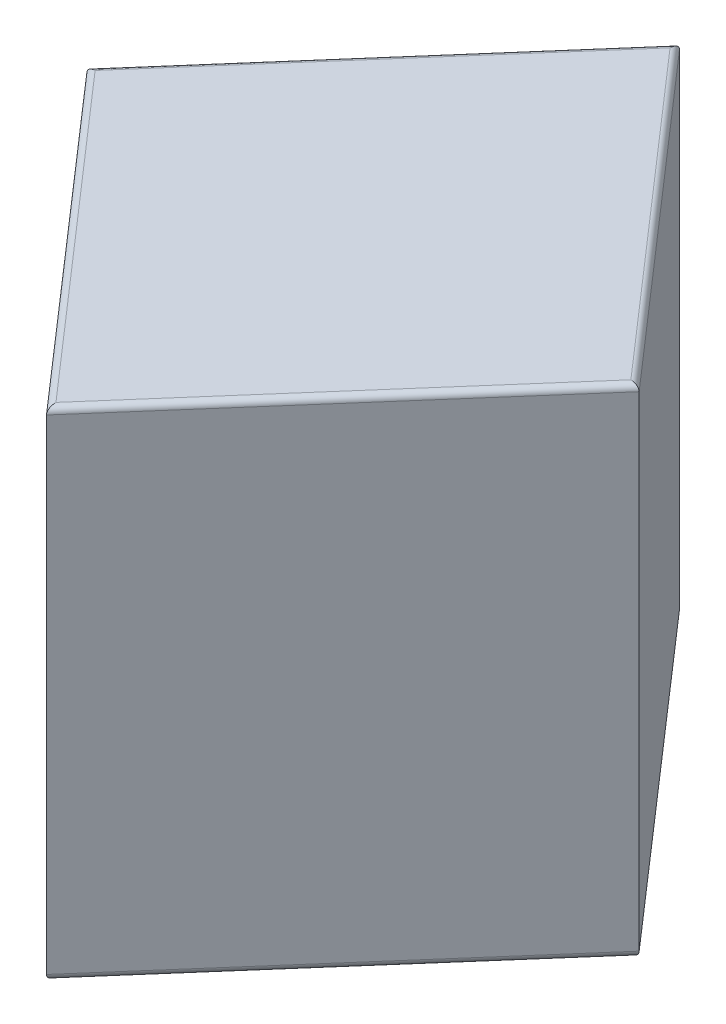
ISO-10303-21;
HEADER;
FILE_DESCRIPTION(('STEP AP214'),'2;1');
FILE_NAME('part.step','',(''),(''),'','','');
FILE_SCHEMA(('AUTOMOTIVE_DESIGN { 1 0 10303 214 1 1 1 1 }'));
ENDSEC;
DATA;
#1=APPLICATION_CONTEXT('core data for automotive mechanical design processes');
#2=APPLICATION_PROTOCOL_DEFINITION('international standard','automotive_design',2000,#1);
#3=PRODUCT_CONTEXT('',#1,'mechanical');
#4=PRODUCT('Part','Part','',(#3));
#5=PRODUCT_RELATED_PRODUCT_CATEGORY('part','',(#4));
#6=PRODUCT_DEFINITION_FORMATION('','',#4);
#7=PRODUCT_DEFINITION_CONTEXT('part definition',#1,'design');
#8=PRODUCT_DEFINITION('design','',#6,#7);
#9=PRODUCT_DEFINITION_SHAPE('','',#8);
#10=(LENGTH_UNIT() NAMED_UNIT(*) SI_UNIT(.MILLI.,.METRE.));
#11=(NAMED_UNIT(*) PLANE_ANGLE_UNIT() SI_UNIT($,.RADIAN.));
#12=(NAMED_UNIT(*) SI_UNIT($,.STERADIAN.) SOLID_ANGLE_UNIT());
#13=UNCERTAINTY_MEASURE_WITH_UNIT(LENGTH_MEASURE(1.E-05),#10,'distance_accuracy_value','');
#14=(GEOMETRIC_REPRESENTATION_CONTEXT(3) GLOBAL_UNCERTAINTY_ASSIGNED_CONTEXT((#13)) GLOBAL_UNIT_ASSIGNED_CONTEXT((#10,
#11,#12)) REPRESENTATION_CONTEXT('',''));
#15=CARTESIAN_POINT('',(0.,0.,0.));
#16=DIRECTION('',(0.,0.,1.));
#17=DIRECTION('',(1.,0.,0.));
#18=AXIS2_PLACEMENT_3D('',#15,#16,#17);
#19=CARTESIAN_POINT('',(0.,40.,25.478872713594));
#20=DIRECTION('',(0.753535334729481,0.,-0.657407407407408));
#21=DIRECTION('',(-0.657407407407408,0.,-0.753535334729481));
#22=AXIS2_PLACEMENT_3D('',#19,#20,#21);
#23=PLANE('',#22);
#24=DIRECTION('',(0.,-1.,0.));
#25=VECTOR('',#24,1.);
#26=CARTESIAN_POINT('',(-22.2285528335752,40.,-5.25842666447823E-07));
#27=LINE('',#26,#25);
#28=CARTESIAN_POINT('',(-22.2285528335752,39.5,-5.25842666447823E-07));
#29=VERTEX_POINT('',#28);
#30=CARTESIAN_POINT('',(-22.2285528335752,0.5,-5.25842666447823E-07));
#31=VERTEX_POINT('',#30);
#32=EDGE_CURVE('E163',#29,#31,#27,.T.);
#33=ORIENTED_EDGE('',*,*,#32,.T.);
#34=DIRECTION('',(0.657407407407408,0.,0.753535334729481));
#35=VECTOR('',#34,1.);
#36=CARTESIAN_POINT('',(0.,0.5,25.478872713594));
#37=LINE('',#36,#35);
#38=CARTESIAN_POINT('',(0.,0.5,25.478872713594));
#39=VERTEX_POINT('',#38);
#40=EDGE_CURVE('E130',#31,#39,#37,.T.);
#41=ORIENTED_EDGE('',*,*,#40,.T.);
#42=DIRECTION('',(0.,-1.,0.));
#43=VECTOR('',#42,1.);
#44=CARTESIAN_POINT('',(0.,40.,25.478872713594));
#45=LINE('',#44,#43);
#46=CARTESIAN_POINT('',(0.,39.5,25.478872713594));
#47=VERTEX_POINT('',#46);
#48=EDGE_CURVE('E114',#47,#39,#45,.T.);
#49=ORIENTED_EDGE('',*,*,#48,.F.);
#50=DIRECTION('',(0.657407407407408,0.,0.753535334729481));
#51=VECTOR('',#50,1.);
#52=CARTESIAN_POINT('',(0.,39.5,25.478872713594));
#53=LINE('',#52,#51);
#54=EDGE_CURVE('E127',#47,#29,#53,.F.);
#55=ORIENTED_EDGE('',*,*,#54,.T.);
#56=EDGE_LOOP('',(#33,#41,#49,#55));
#57=FACE_BOUND('',#56,.T.);
#58=ADVANCED_FACE('F43',(#57),#23,.F.);
#59=CARTESIAN_POINT('',(22.2285528335751,40.,-5.25842675826171E-07));
#60=DIRECTION('',(-0.753535334729482,0.,-0.657407407407407));
#61=DIRECTION('',(-0.657407407407407,0.,0.753535334729482));
#62=AXIS2_PLACEMENT_3D('',#59,#60,#61);
#63=PLANE('',#62);
#64=ORIENTED_EDGE('',*,*,#48,.T.);
#65=DIRECTION('',(0.657407407407407,0.,-0.753535334729482));
#66=VECTOR('',#65,1.);
#67=CARTESIAN_POINT('',(22.2285528335751,0.5,-5.25842675949297E-07));
#68=LINE('',#67,#66);
#69=CARTESIAN_POINT('',(22.2285528335751,0.5,-5.25842675826171E-07));
#70=VERTEX_POINT('',#69);
#71=EDGE_CURVE('E120',#39,#70,#68,.T.);
#72=ORIENTED_EDGE('',*,*,#71,.T.);
#73=DIRECTION('',(0.,-1.,0.));
#74=VECTOR('',#73,1.);
#75=CARTESIAN_POINT('',(22.2285528335751,40.,-5.25842675826171E-07));
#76=LINE('',#75,#74);
#77=CARTESIAN_POINT('',(22.2285528335751,39.5,-5.25842675826171E-07));
#78=VERTEX_POINT('',#77);
#79=EDGE_CURVE('E116',#78,#70,#76,.T.);
#80=ORIENTED_EDGE('',*,*,#79,.F.);
#81=DIRECTION('',(0.657407407407407,0.,-0.753535334729482));
#82=VECTOR('',#81,1.);
#83=CARTESIAN_POINT('',(22.2285528335751,39.5,-5.25842675826171E-07));
#84=LINE('',#83,#82);
#85=EDGE_CURVE('E111',#78,#47,#84,.F.);
#86=ORIENTED_EDGE('',*,*,#85,.T.);
#87=EDGE_LOOP('',(#64,#72,#80,#86));
#88=FACE_BOUND('',#87,.T.);
#89=ADVANCED_FACE('F113',(#88),#63,.F.);
#90=CARTESIAN_POINT('',(0.,40.,-25.4788737652793));
#91=DIRECTION('',(-0.753535334729481,0.,0.657407407407407));
#92=DIRECTION('',(0.657407407407407,0.,0.753535334729481));
#93=AXIS2_PLACEMENT_3D('',#90,#91,#92);
#94=PLANE('',#93);
#95=ORIENTED_EDGE('',*,*,#79,.T.);
#96=DIRECTION('',(-0.657407407407407,0.,-0.753535334729481));
#97=VECTOR('',#96,1.);
#98=CARTESIAN_POINT('',(0.,0.5,-25.4788737652793));
#99=LINE('',#98,#97);
#100=CARTESIAN_POINT('',(0.,0.5,-25.4788737652793));
#101=VERTEX_POINT('',#100);
#102=EDGE_CURVE('E187',#70,#101,#99,.T.);
#103=ORIENTED_EDGE('',*,*,#102,.T.);
#104=DIRECTION('',(0.,-1.,0.));
#105=VECTOR('',#104,1.);
#106=CARTESIAN_POINT('',(0.,40.,-25.4788737652793));
#107=LINE('',#106,#105);
#108=CARTESIAN_POINT('',(0.,39.5,-25.4788737652793));
#109=VERTEX_POINT('',#108);
#110=EDGE_CURVE('E168',#109,#101,#107,.T.);
#111=ORIENTED_EDGE('',*,*,#110,.F.);
#112=DIRECTION('',(-0.657407407407407,0.,-0.753535334729481));
#113=VECTOR('',#112,1.);
#114=CARTESIAN_POINT('',(0.,39.5,-25.4788737652793));
#115=LINE('',#114,#113);
#116=EDGE_CURVE('E185',#109,#78,#115,.F.);
#117=ORIENTED_EDGE('',*,*,#116,.T.);
#118=EDGE_LOOP('',(#95,#103,#111,#117));
#119=FACE_BOUND('',#118,.T.);
#120=ADVANCED_FACE('F204',(#119),#94,.F.);
#121=CARTESIAN_POINT('',(-22.2285528335752,40.,-5.25842666447823E-07));
#122=DIRECTION('',(0.753535334729481,0.,0.657407407407407));
#123=DIRECTION('',(0.657407407407407,0.,-0.753535334729481));
#124=AXIS2_PLACEMENT_3D('',#121,#122,#123);
#125=PLANE('',#124);
#126=ORIENTED_EDGE('',*,*,#110,.T.);
#127=DIRECTION('',(-0.657407407407407,0.,0.753535334729481));
#128=VECTOR('',#127,1.);
#129=CARTESIAN_POINT('',(-22.2285528335752,0.5,-5.25842666417041E-07));
#130=LINE('',#129,#128);
#131=EDGE_CURVE('E191',#101,#31,#130,.T.);
#132=ORIENTED_EDGE('',*,*,#131,.T.);
#133=ORIENTED_EDGE('',*,*,#32,.F.);
#134=DIRECTION('',(-0.657407407407407,0.,0.753535334729481));
#135=VECTOR('',#134,1.);
#136=CARTESIAN_POINT('',(-22.2285528335752,39.5,-5.25842666447823E-07));
#137=LINE('',#136,#135);
#138=EDGE_CURVE('E189',#29,#109,#137,.F.);
#139=ORIENTED_EDGE('',*,*,#138,.T.);
#140=EDGE_LOOP('',(#126,#132,#133,#139));
#141=FACE_BOUND('',#140,.T.);
#142=ADVANCED_FACE('F202',(#141),#125,.F.);
#143=CARTESIAN_POINT('',(0.,40.,0.));
#144=DIRECTION('',(0.,-1.,0.));
#145=DIRECTION('',(0.,0.,-1.));
#146=AXIS2_PLACEMENT_3D('',#143,#144,#145);
#147=PLANE('',#146);
#148=DIRECTION('',(-0.657407407407407,0.,0.753535334729481));
#149=VECTOR('',#148,1.);
#150=CARTESIAN_POINT('',(-12.2449494498459,40.,-10.6828705976314));
#151=LINE('',#150,#149);
#152=CARTESIAN_POINT('',(0.,40.,-24.7183103849976));
#153=VERTEX_POINT('',#152);
#154=CARTESIAN_POINT('',(-21.5650139430207,40.,-5.25842665452247E-07));
#155=VERTEX_POINT('',#154);
#156=EDGE_CURVE('E193',#153,#155,#151,.T.);
#157=ORIENTED_EDGE('',*,*,#156,.T.);
#158=DIRECTION('',(0.657407407407408,0.,0.753535334729481));
#159=VECTOR('',#158,1.);
#160=CARTESIAN_POINT('',(-12.2449489288623,40.,10.6828701431093));
#161=LINE('',#160,#159);
#162=CARTESIAN_POINT('',(0.,40.,24.7183093333123));
#163=VERTEX_POINT('',#162);
#164=EDGE_CURVE('E11',#155,#163,#161,.T.);
#165=ORIENTED_EDGE('',*,*,#164,.T.);
#166=DIRECTION('',(0.657407407407407,0.,-0.753535334729482));
#167=VECTOR('',#166,1.);
#168=CARTESIAN_POINT('',(12.2449489288623,40.,10.6828701431093));
#169=LINE('',#168,#167);
#170=CARTESIAN_POINT('',(21.5650139430207,40.,-5.25842671451091E-07));
#171=VERTEX_POINT('',#170);
#172=EDGE_CURVE('E52',#163,#171,#169,.T.);
#173=ORIENTED_EDGE('',*,*,#172,.T.);
#174=DIRECTION('',(-0.657407407407407,0.,-0.753535334729481));
#175=VECTOR('',#174,1.);
#176=CARTESIAN_POINT('',(12.2449494498459,40.,-10.6828705976314));
#177=LINE('',#176,#175);
#178=EDGE_CURVE('E195',#171,#153,#177,.T.);
#179=ORIENTED_EDGE('',*,*,#178,.T.);
#180=EDGE_LOOP('',(#157,#165,#173,#179));
#181=FACE_BOUND('',#180,.T.);
#182=ADVANCED_FACE('F196',(#181),#147,.F.);
#183=CARTESIAN_POINT('',(0.,0.,0.));
#184=DIRECTION('',(0.,-1.,0.));
#185=DIRECTION('',(0.,0.,-1.));
#186=AXIS2_PLACEMENT_3D('',#183,#184,#185);
#187=PLANE('',#186);
#188=DIRECTION('',(0.657407407407407,0.,-0.753535334729482));
#189=VECTOR('',#188,1.);
#190=CARTESIAN_POINT('',(-0.37676766736474,0.,25.1501690098903));
#191=LINE('',#190,#189);
#192=CARTESIAN_POINT('',(21.5650139430207,0.,-5.25842674113237E-07));
#193=VERTEX_POINT('',#192);
#194=CARTESIAN_POINT('',(0.,0.,24.7183093333123));
#195=VERTEX_POINT('',#194);
#196=EDGE_CURVE('E180',#193,#195,#191,.F.);
#197=ORIENTED_EDGE('',*,*,#196,.T.);
#198=DIRECTION('',(0.657407407407408,0.,0.753535334729481));
#199=VECTOR('',#198,1.);
#200=CARTESIAN_POINT('',(-21.8517851662104,0.,-0.328704229546371));
#201=LINE('',#200,#199);
#202=CARTESIAN_POINT('',(-21.5650139430207,0.,-5.25842666184628E-07));
#203=VERTEX_POINT('',#202);
#204=EDGE_CURVE('E121',#195,#203,#201,.F.);
#205=ORIENTED_EDGE('',*,*,#204,.T.);
#206=DIRECTION('',(-0.657407407407407,0.,0.753535334729481));
#207=VECTOR('',#206,1.);
#208=CARTESIAN_POINT('',(0.376767667364733,0.,-25.1501700615756));
#209=LINE('',#208,#207);
#210=CARTESIAN_POINT('',(0.,0.,-24.7183103849976));
#211=VERTEX_POINT('',#210);
#212=EDGE_CURVE('E176',#203,#211,#209,.F.);
#213=ORIENTED_EDGE('',*,*,#212,.T.);
#214=DIRECTION('',(-0.657407407407407,0.,-0.753535334729481));
#215=VECTOR('',#214,1.);
#216=CARTESIAN_POINT('',(21.8517851662104,0.,0.328703177861031));
#217=LINE('',#216,#215);
#218=EDGE_CURVE('E178',#211,#193,#217,.F.);
#219=ORIENTED_EDGE('',*,*,#218,.T.);
#220=EDGE_LOOP('',(#197,#205,#213,#219));
#221=FACE_BOUND('',#220,.T.);
#222=ADVANCED_FACE('F230',(#221),#187,.T.);
#223=CARTESIAN_POINT('',(-0.376767667364755,0.5,-25.1501700615756));
#224=DIRECTION('',(0.657407407407407,0.,0.753535334729481));
#225=DIRECTION('',(0.753535334729481,0.,-0.657407407407407));
#226=AXIS2_PLACEMENT_3D('',#223,#224,#225);
#227=CYLINDRICAL_SURFACE('',#226,0.5);
#228=CARTESIAN_POINT('',(21.5650139430206,0.5,-5.25842683740847E-07));
#229=DIRECTION('',(0.,0.,1.));
#230=DIRECTION('',(1.,0.,0.));
#231=AXIS2_PLACEMENT_3D('',#228,#229,#230);
#232=ELLIPSE('',#231,0.663538890554482,0.5);
#233=EDGE_CURVE('E155',#193,#70,#232,.T.);
#234=ORIENTED_EDGE('',*,*,#233,.F.);
#235=ORIENTED_EDGE('',*,*,#218,.F.);
#236=CARTESIAN_POINT('',(0.,0.5,-24.7183103849976));
#237=DIRECTION('',(1.,0.,0.));
#238=DIRECTION('',(0.,0.,-1.));
#239=AXIS2_PLACEMENT_3D('',#236,#237,#238);
#240=ELLIPSE('',#239,0.76056338028169,0.5);
#241=EDGE_CURVE('E142',#101,#211,#240,.F.);
#242=ORIENTED_EDGE('',*,*,#241,.F.);
#243=ORIENTED_EDGE('',*,*,#102,.F.);
#244=EDGE_LOOP('',(#234,#235,#242,#243));
#245=FACE_BOUND('',#244,.T.);
#246=ADVANCED_FACE('F207',(#245),#227,.T.);
#247=CARTESIAN_POINT('',(-21.8517851662104,0.5,0.328703177861037));
#248=DIRECTION('',(0.657407407407407,0.,-0.753535334729481));
#249=DIRECTION('',(-0.753535334729481,0.,-0.657407407407407));
#250=AXIS2_PLACEMENT_3D('',#247,#248,#249);
#251=CYLINDRICAL_SURFACE('',#250,0.5);
#252=ORIENTED_EDGE('',*,*,#241,.T.);
#253=ORIENTED_EDGE('',*,*,#212,.F.);
#254=CARTESIAN_POINT('',(-21.5650139430207,0.5,-5.25842667071239E-07));
#255=DIRECTION('',(0.,0.,-1.));
#256=DIRECTION('',(1.,0.,0.));
#257=AXIS2_PLACEMENT_3D('',#254,#255,#256);
#258=ELLIPSE('',#257,0.663538890554482,0.5);
#259=EDGE_CURVE('E149',#31,#203,#258,.F.);
#260=ORIENTED_EDGE('',*,*,#259,.F.);
#261=ORIENTED_EDGE('',*,*,#131,.F.);
#262=EDGE_LOOP('',(#252,#253,#260,#261));
#263=FACE_BOUND('',#262,.T.);
#264=ADVANCED_FACE('F209',(#263),#251,.T.);
#265=CARTESIAN_POINT('',(21.8517851662104,0.5,-0.328704229546379));
#266=DIRECTION('',(-0.657407407407407,0.,0.753535334729482));
#267=DIRECTION('',(0.753535334729482,0.,0.657407407407407));
#268=AXIS2_PLACEMENT_3D('',#265,#266,#267);
#269=CYLINDRICAL_SURFACE('',#268,0.5);
#270=ORIENTED_EDGE('',*,*,#233,.T.);
#271=ORIENTED_EDGE('',*,*,#71,.F.);
#272=CARTESIAN_POINT('',(0.,0.5,24.7183093333123));
#273=DIRECTION('',(-1.,0.,0.));
#274=DIRECTION('',(0.,0.,1.));
#275=AXIS2_PLACEMENT_3D('',#272,#273,#274);
#276=ELLIPSE('',#275,0.76056338028169,0.5);
#277=EDGE_CURVE('E145',#195,#39,#276,.T.);
#278=ORIENTED_EDGE('',*,*,#277,.F.);
#279=ORIENTED_EDGE('',*,*,#196,.F.);
#280=EDGE_LOOP('',(#270,#271,#278,#279));
#281=FACE_BOUND('',#280,.T.);
#282=ADVANCED_FACE('F212',(#281),#269,.T.);
#283=CARTESIAN_POINT('',(0.376767667364747,0.5,25.1501690098903));
#284=DIRECTION('',(-0.657407407407408,0.,-0.753535334729481));
#285=DIRECTION('',(-0.753535334729481,0.,0.657407407407408));
#286=AXIS2_PLACEMENT_3D('',#283,#284,#285);
#287=CYLINDRICAL_SURFACE('',#286,0.5);
#288=ORIENTED_EDGE('',*,*,#259,.T.);
#289=ORIENTED_EDGE('',*,*,#204,.F.);
#290=ORIENTED_EDGE('',*,*,#277,.T.);
#291=ORIENTED_EDGE('',*,*,#40,.F.);
#292=EDGE_LOOP('',(#288,#289,#290,#291));
#293=FACE_BOUND('',#292,.T.);
#294=ADVANCED_FACE('F210',(#293),#287,.T.);
#295=CARTESIAN_POINT('',(12.2449494498459,39.5,-10.6828705976314));
#296=DIRECTION('',(-0.657407407407407,0.,-0.753535334729481));
#297=DIRECTION('',(-0.753535334729481,0.,0.657407407407407));
#298=AXIS2_PLACEMENT_3D('',#295,#296,#297);
#299=CYLINDRICAL_SURFACE('',#298,0.5);
#300=CARTESIAN_POINT('',(21.5650139430207,39.5,-5.25842677560895E-07));
#301=DIRECTION('',(0.,0.,-1.));
#302=DIRECTION('',(-1.,0.,0.));
#303=AXIS2_PLACEMENT_3D('',#300,#301,#302);
#304=ELLIPSE('',#303,0.663538890554482,0.5);
#305=EDGE_CURVE('E139',#78,#171,#304,.F.);
#306=ORIENTED_EDGE('',*,*,#305,.F.);
#307=ORIENTED_EDGE('',*,*,#116,.F.);
#308=CARTESIAN_POINT('',(0.,39.5,-24.7183103849976));
#309=DIRECTION('',(-1.,0.,0.));
#310=DIRECTION('',(0.,0.,1.));
#311=AXIS2_PLACEMENT_3D('',#308,#309,#310);
#312=ELLIPSE('',#311,0.76056338028169,0.5);
#313=EDGE_CURVE('E47',#153,#109,#312,.T.);
#314=ORIENTED_EDGE('',*,*,#313,.F.);
#315=ORIENTED_EDGE('',*,*,#178,.F.);
#316=EDGE_LOOP('',(#306,#307,#314,#315));
#317=FACE_BOUND('',#316,.T.);
#318=ADVANCED_FACE('F45',(#317),#299,.T.);
#319=CARTESIAN_POINT('',(-12.2449494498459,39.5,-10.6828705976314));
#320=DIRECTION('',(-0.657407407407407,0.,0.753535334729481));
#321=DIRECTION('',(0.753535334729481,0.,0.657407407407407));
#322=AXIS2_PLACEMENT_3D('',#319,#320,#321);
#323=CYLINDRICAL_SURFACE('',#322,0.5);
#324=ORIENTED_EDGE('',*,*,#313,.T.);
#325=ORIENTED_EDGE('',*,*,#138,.F.);
#326=CARTESIAN_POINT('',(-21.5650139430207,39.5,-5.25842666285192E-07));
#327=DIRECTION('',(0.,0.,1.));
#328=DIRECTION('',(-1.,0.,0.));
#329=AXIS2_PLACEMENT_3D('',#326,#327,#328);
#330=ELLIPSE('',#329,0.663538890554482,0.5);
#331=EDGE_CURVE('E134',#155,#29,#330,.T.);
#332=ORIENTED_EDGE('',*,*,#331,.F.);
#333=ORIENTED_EDGE('',*,*,#156,.F.);
#334=EDGE_LOOP('',(#324,#325,#332,#333));
#335=FACE_BOUND('',#334,.T.);
#336=ADVANCED_FACE('F199',(#335),#323,.T.);
#337=CARTESIAN_POINT('',(12.2449489288623,39.5,10.6828701431093));
#338=DIRECTION('',(0.657407407407407,0.,-0.753535334729482));
#339=DIRECTION('',(-0.753535334729482,0.,-0.657407407407407));
#340=AXIS2_PLACEMENT_3D('',#337,#338,#339);
#341=CYLINDRICAL_SURFACE('',#340,0.5);
#342=ORIENTED_EDGE('',*,*,#305,.T.);
#343=ORIENTED_EDGE('',*,*,#172,.F.);
#344=CARTESIAN_POINT('',(0.,39.5,24.7183093333123));
#345=DIRECTION('',(1.,0.,0.));
#346=DIRECTION('',(0.,0.,-1.));
#347=AXIS2_PLACEMENT_3D('',#344,#345,#346);
#348=ELLIPSE('',#347,0.76056338028169,0.5);
#349=EDGE_CURVE('E60',#47,#163,#348,.F.);
#350=ORIENTED_EDGE('',*,*,#349,.F.);
#351=ORIENTED_EDGE('',*,*,#85,.F.);
#352=EDGE_LOOP('',(#342,#343,#350,#351));
#353=FACE_BOUND('',#352,.T.);
#354=ADVANCED_FACE('F137',(#353),#341,.T.);
#355=CARTESIAN_POINT('',(-12.2449489288623,39.5,10.6828701431093));
#356=DIRECTION('',(0.657407407407408,0.,0.753535334729481));
#357=DIRECTION('',(0.753535334729481,0.,-0.657407407407408));
#358=AXIS2_PLACEMENT_3D('',#355,#356,#357);
#359=CYLINDRICAL_SURFACE('',#358,0.5);
#360=ORIENTED_EDGE('',*,*,#331,.T.);
#361=ORIENTED_EDGE('',*,*,#54,.F.);
#362=ORIENTED_EDGE('',*,*,#349,.T.);
#363=ORIENTED_EDGE('',*,*,#164,.F.);
#364=EDGE_LOOP('',(#360,#361,#362,#363));
#365=FACE_BOUND('',#364,.T.);
#366=ADVANCED_FACE('F132',(#365),#359,.T.);
#367=CLOSED_SHELL('',(#58,#89,#120,#142,#182,#222,#246,#264,#282,#294,#318,#336,#354,#366));
#368=MANIFOLD_SOLID_BREP('B2',#367);
#369=ADVANCED_BREP_SHAPE_REPRESENTATION('',(#18,#368),#14);
#370=SHAPE_DEFINITION_REPRESENTATION(#9,#369);
ENDSEC;
END-ISO-10303-21;
